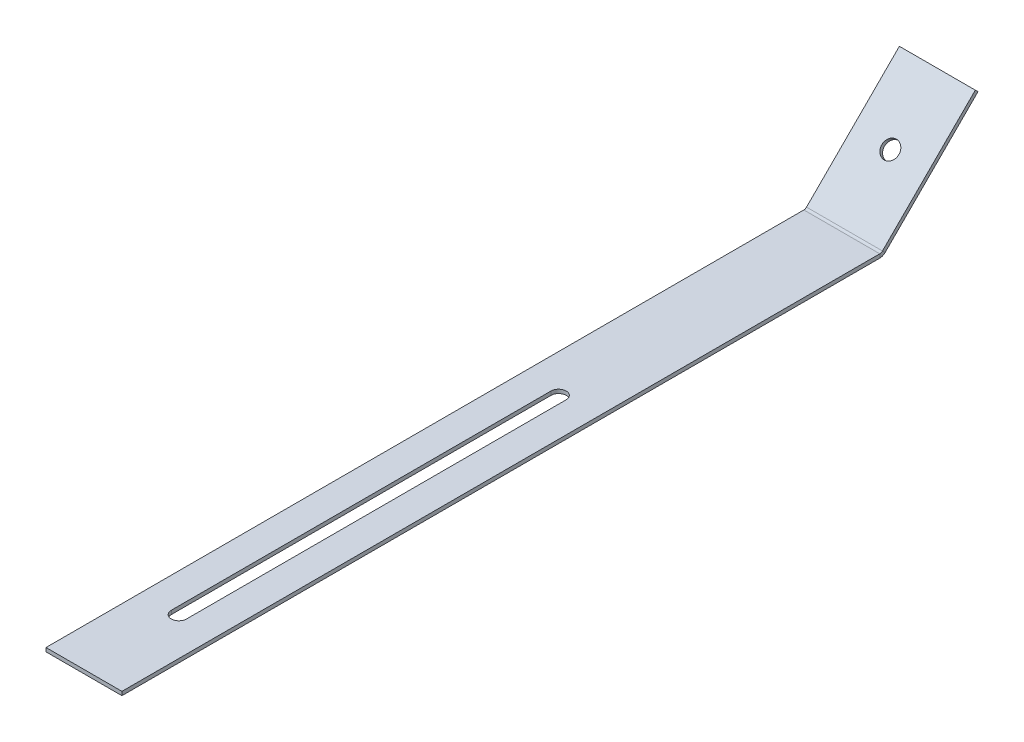
ISO-10303-21;
HEADER;
FILE_DESCRIPTION(('STEP AP214'),'2;1');
FILE_NAME('part.step','',(''),(''),'','','');
FILE_SCHEMA(('AUTOMOTIVE_DESIGN { 1 0 10303 214 1 1 1 1 }'));
ENDSEC;
DATA;
#1=APPLICATION_CONTEXT('core data for automotive mechanical design processes');
#2=APPLICATION_PROTOCOL_DEFINITION('international standard','automotive_design',2000,#1);
#3=PRODUCT_CONTEXT('',#1,'mechanical');
#4=PRODUCT('Part','Part','',(#3));
#5=PRODUCT_RELATED_PRODUCT_CATEGORY('part','',(#4));
#6=PRODUCT_DEFINITION_FORMATION('','',#4);
#7=PRODUCT_DEFINITION_CONTEXT('part definition',#1,'design');
#8=PRODUCT_DEFINITION('design','',#6,#7);
#9=PRODUCT_DEFINITION_SHAPE('','',#8);
#10=(LENGTH_UNIT() NAMED_UNIT(*) SI_UNIT(.MILLI.,.METRE.));
#11=(NAMED_UNIT(*) PLANE_ANGLE_UNIT() SI_UNIT($,.RADIAN.));
#12=(NAMED_UNIT(*) SI_UNIT($,.STERADIAN.) SOLID_ANGLE_UNIT());
#13=UNCERTAINTY_MEASURE_WITH_UNIT(LENGTH_MEASURE(1.E-05),#10,'distance_accuracy_value','');
#14=(GEOMETRIC_REPRESENTATION_CONTEXT(3) GLOBAL_UNCERTAINTY_ASSIGNED_CONTEXT((#13)) GLOBAL_UNIT_ASSIGNED_CONTEXT((#10,
#11,#12)) REPRESENTATION_CONTEXT('',''));
#15=CARTESIAN_POINT('',(0.,0.,0.));
#16=DIRECTION('',(0.,0.,1.));
#17=DIRECTION('',(1.,0.,0.));
#18=AXIS2_PLACEMENT_3D('',#15,#16,#17);
#19=CARTESIAN_POINT('',(40.,0.585786437626914,-400.585786437627));
#20=DIRECTION('',(1.,0.,0.));
#21=DIRECTION('',(0.,0.,-1.));
#22=AXIS2_PLACEMENT_3D('',#19,#20,#21);
#23=PLANE('',#22);
#24=DIRECTION('',(0.,-0.707106781186547,-0.707106781186547));
#25=VECTOR('',#24,1.);
#26=CARTESIAN_POINT('',(40.,0.585786437626914,-400.585786437627));
#27=LINE('',#26,#25);
#28=CARTESIAN_POINT('',(40.,0.585786437626914,-400.585786437627));
#29=VERTEX_POINT('',#28);
#30=CARTESIAN_POINT('',(40.,-0.828427124746176,-402.));
#31=VERTEX_POINT('',#30);
#32=EDGE_CURVE('E11',#29,#31,#27,.T.);
#33=ORIENTED_EDGE('',*,*,#32,.F.);
#34=CARTESIAN_POINT('',(40.,1.99999999999999,-399.171572875254));
#35=DIRECTION('',(-1.,0.,0.));
#36=DIRECTION('',(0.,0.,1.));
#37=AXIS2_PLACEMENT_3D('',#34,#35,#36);
#38=CIRCLE('',#37,2.);
#39=CARTESIAN_POINT('',(40.,0.,-399.171572875254));
#40=VERTEX_POINT('',#39);
#41=EDGE_CURVE('E179',#40,#29,#38,.F.);
#42=ORIENTED_EDGE('',*,*,#41,.F.);
#43=DIRECTION('',(0.,1.,0.));
#44=VECTOR('',#43,1.);
#45=CARTESIAN_POINT('',(40.,-2.00000000000001,-399.171572875254));
#46=LINE('',#45,#44);
#47=CARTESIAN_POINT('',(40.,-2.00000000000001,-399.171572875254));
#48=VERTEX_POINT('',#47);
#49=EDGE_CURVE('E52',#48,#40,#46,.T.);
#50=ORIENTED_EDGE('',*,*,#49,.F.);
#51=CARTESIAN_POINT('',(40.,1.99999999999999,-399.171572875254));
#52=DIRECTION('',(1.,0.,0.));
#53=DIRECTION('',(0.,0.,-1.));
#54=AXIS2_PLACEMENT_3D('',#51,#52,#53);
#55=CIRCLE('',#54,4.);
#56=EDGE_CURVE('E191',#48,#31,#55,.T.);
#57=ORIENTED_EDGE('',*,*,#56,.T.);
#58=EDGE_LOOP('',(#33,#42,#50,#57));
#59=FACE_BOUND('',#58,.T.);
#60=ADVANCED_FACE('F45',(#59),#23,.T.);
#61=CARTESIAN_POINT('',(40.,-2.00000000000001,-399.171572875254));
#62=DIRECTION('',(1.,0.,0.));
#63=DIRECTION('',(0.,0.,-1.));
#64=AXIS2_PLACEMENT_3D('',#61,#62,#63);
#65=PLANE('',#64);
#66=DIRECTION('',(0.,0.70710678118655,-0.707106781186545));
#67=VECTOR('',#66,1.);
#68=CARTESIAN_POINT('',(40.,0.,-400.));
#69=LINE('',#68,#67);
#70=CARTESIAN_POINT('',(40.,49.4974746830584,-449.497474683058));
#71=VERTEX_POINT('',#70);
#72=EDGE_CURVE('E176',#29,#71,#69,.T.);
#73=ORIENTED_EDGE('',*,*,#72,.F.);
#74=ORIENTED_EDGE('',*,*,#32,.T.);
#75=DIRECTION('',(0.,0.70710678118655,-0.707106781186545));
#76=VECTOR('',#75,1.);
#77=CARTESIAN_POINT('',(40.,-1.41421356237309,-401.414213562373));
#78=LINE('',#77,#76);
#79=CARTESIAN_POINT('',(40.,48.0832611206854,-450.911688245431));
#80=VERTEX_POINT('',#79);
#81=EDGE_CURVE('E170',#31,#80,#78,.T.);
#82=ORIENTED_EDGE('',*,*,#81,.T.);
#83=DIRECTION('',(0.,-0.707106781186547,-0.707106781186547));
#84=VECTOR('',#83,1.);
#85=CARTESIAN_POINT('',(40.,49.4974746830584,-449.497474683058));
#86=LINE('',#85,#84);
#87=EDGE_CURVE('E172',#71,#80,#86,.T.);
#88=ORIENTED_EDGE('',*,*,#87,.F.);
#89=EDGE_LOOP('',(#73,#74,#82,#88));
#90=FACE_BOUND('',#89,.T.);
#91=ADVANCED_FACE('F272',(#90),#65,.T.);
#92=CARTESIAN_POINT('',(0.,0.,-399.171572875254));
#93=DIRECTION('',(-1.,0.,0.));
#94=DIRECTION('',(0.,0.,1.));
#95=AXIS2_PLACEMENT_3D('',#92,#93,#94);
#96=PLANE('',#95);
#97=DIRECTION('',(0.,-1.,0.));
#98=VECTOR('',#97,1.);
#99=CARTESIAN_POINT('',(0.,0.,-399.171572875254));
#100=LINE('',#99,#98);
#101=CARTESIAN_POINT('',(0.,0.,-399.171572875254));
#102=VERTEX_POINT('',#101);
#103=CARTESIAN_POINT('',(0.,-2.00000000000001,-399.171572875254));
#104=VERTEX_POINT('',#103);
#105=EDGE_CURVE('E238',#102,#104,#100,.T.);
#106=ORIENTED_EDGE('',*,*,#105,.F.);
#107=CARTESIAN_POINT('',(0.,1.99999999999999,-399.171572875254));
#108=DIRECTION('',(-1.,0.,0.));
#109=DIRECTION('',(0.,0.,1.));
#110=AXIS2_PLACEMENT_3D('',#107,#108,#109);
#111=CIRCLE('',#110,2.);
#112=CARTESIAN_POINT('',(0.,0.585786437626914,-400.585786437627));
#113=VERTEX_POINT('',#112);
#114=EDGE_CURVE('E203',#102,#113,#111,.F.);
#115=ORIENTED_EDGE('',*,*,#114,.T.);
#116=DIRECTION('',(0.,0.707106781186547,0.707106781186547));
#117=VECTOR('',#116,1.);
#118=CARTESIAN_POINT('',(0.,-0.828427124746176,-402.));
#119=LINE('',#118,#117);
#120=CARTESIAN_POINT('',(0.,-0.828427124746176,-402.));
#121=VERTEX_POINT('',#120);
#122=EDGE_CURVE('E236',#121,#113,#119,.T.);
#123=ORIENTED_EDGE('',*,*,#122,.F.);
#124=CARTESIAN_POINT('',(0.,1.99999999999999,-399.171572875254));
#125=DIRECTION('',(1.,0.,0.));
#126=DIRECTION('',(0.,0.,-1.));
#127=AXIS2_PLACEMENT_3D('',#124,#125,#126);
#128=CIRCLE('',#127,4.);
#129=EDGE_CURVE('E173',#104,#121,#128,.T.);
#130=ORIENTED_EDGE('',*,*,#129,.F.);
#131=EDGE_LOOP('',(#106,#115,#123,#130));
#132=FACE_BOUND('',#131,.T.);
#133=ADVANCED_FACE('F279',(#132),#96,.T.);
#134=CARTESIAN_POINT('',(0.,-0.828427124746176,-402.));
#135=DIRECTION('',(-1.,0.,0.));
#136=DIRECTION('',(0.,0.,1.));
#137=AXIS2_PLACEMENT_3D('',#134,#135,#136);
#138=PLANE('',#137);
#139=DIRECTION('',(0.,0.,-1.));
#140=VECTOR('',#139,1.);
#141=CARTESIAN_POINT('',(0.,0.,0.));
#142=LINE('',#141,#140);
#143=CARTESIAN_POINT('',(0.,0.,0.));
#144=VERTEX_POINT('',#143);
#145=EDGE_CURVE('E206',#144,#102,#142,.T.);
#146=ORIENTED_EDGE('',*,*,#145,.T.);
#147=ORIENTED_EDGE('',*,*,#105,.T.);
#148=DIRECTION('',(0.,0.,-1.));
#149=VECTOR('',#148,1.);
#150=CARTESIAN_POINT('',(0.,-2.,0.));
#151=LINE('',#150,#149);
#152=CARTESIAN_POINT('',(0.,-2.,0.));
#153=VERTEX_POINT('',#152);
#154=EDGE_CURVE('E212',#153,#104,#151,.T.);
#155=ORIENTED_EDGE('',*,*,#154,.F.);
#156=DIRECTION('',(0.,1.,0.));
#157=VECTOR('',#156,1.);
#158=CARTESIAN_POINT('',(0.,-2.,0.));
#159=LINE('',#158,#157);
#160=EDGE_CURVE('E209',#153,#144,#159,.T.);
#161=ORIENTED_EDGE('',*,*,#160,.T.);
#162=EDGE_LOOP('',(#146,#147,#155,#161));
#163=FACE_BOUND('',#162,.T.);
#164=ADVANCED_FACE('F281',(#163),#138,.T.);
#165=CARTESIAN_POINT('',(40.,-1.41421356237309,-401.414213562373));
#166=DIRECTION('',(0.,0.707106781186545,0.70710678118655));
#167=DIRECTION('',(0.,-0.70710678118655,0.707106781186545));
#168=AXIS2_PLACEMENT_3D('',#165,#166,#167);
#169=PLANE('',#168);
#170=CARTESIAN_POINT('',(20.,23.3345237791561,-426.162950903902));
#171=DIRECTION('',(0.,0.707106781186545,0.70710678118655));
#172=DIRECTION('',(0.,-0.70710678118655,0.707106781186545));
#173=AXIS2_PLACEMENT_3D('',#170,#171,#172);
#174=CIRCLE('',#173,4.50000000000001);
#175=CARTESIAN_POINT('',(20.,20.1525432638167,-422.980970388563));
#176=VERTEX_POINT('',#175);
#177=EDGE_CURVE('E166',#176,#176,#174,.F.);
#178=ORIENTED_EDGE('',*,*,#177,.F.);
#179=EDGE_LOOP('',(#178));
#180=FACE_BOUND('',#179,.T.);
#181=DIRECTION('',(0.,0.70710678118655,-0.707106781186545));
#182=VECTOR('',#181,1.);
#183=CARTESIAN_POINT('',(0.,-1.41421356237309,-401.414213562373));
#184=LINE('',#183,#182);
#185=CARTESIAN_POINT('',(0.,48.0832611206854,-450.911688245431));
#186=VERTEX_POINT('',#185);
#187=EDGE_CURVE('E169',#121,#186,#184,.T.);
#188=ORIENTED_EDGE('',*,*,#187,.T.);
#189=DIRECTION('',(-1.,0.,0.));
#190=VECTOR('',#189,1.);
#191=CARTESIAN_POINT('',(40.,48.0832611206854,-450.911688245431));
#192=LINE('',#191,#190);
#193=EDGE_CURVE('E234',#80,#186,#192,.T.);
#194=ORIENTED_EDGE('',*,*,#193,.F.);
#195=ORIENTED_EDGE('',*,*,#81,.F.);
#196=DIRECTION('',(-1.,0.,0.));
#197=VECTOR('',#196,1.);
#198=CARTESIAN_POINT('',(40.,-0.828427124746176,-402.));
#199=LINE('',#198,#197);
#200=EDGE_CURVE('E194',#31,#121,#199,.T.);
#201=ORIENTED_EDGE('',*,*,#200,.T.);
#202=EDGE_LOOP('',(#188,#194,#195,#201));
#203=FACE_BOUND('',#202,.T.);
#204=ADVANCED_FACE('F268',(#180,#203),#169,.F.);
#205=CARTESIAN_POINT('',(40.,49.4974746830584,-449.497474683058));
#206=DIRECTION('',(0.,0.707106781186548,-0.707106781186548));
#207=DIRECTION('',(0.,0.707106781186548,0.707106781186548));
#208=AXIS2_PLACEMENT_3D('',#205,#206,#207);
#209=PLANE('',#208);
#210=DIRECTION('',(0.,-0.707106781186547,-0.707106781186547));
#211=VECTOR('',#210,1.);
#212=CARTESIAN_POINT('',(0.,49.4974746830584,-449.497474683058));
#213=LINE('',#212,#211);
#214=CARTESIAN_POINT('',(0.,49.4974746830584,-449.497474683058));
#215=VERTEX_POINT('',#214);
#216=EDGE_CURVE('E197',#215,#186,#213,.T.);
#217=ORIENTED_EDGE('',*,*,#216,.F.);
#218=DIRECTION('',(-1.,0.,0.));
#219=VECTOR('',#218,1.);
#220=CARTESIAN_POINT('',(40.,49.4974746830584,-449.497474683058));
#221=LINE('',#220,#219);
#222=EDGE_CURVE('E232',#71,#215,#221,.T.);
#223=ORIENTED_EDGE('',*,*,#222,.F.);
#224=ORIENTED_EDGE('',*,*,#87,.T.);
#225=ORIENTED_EDGE('',*,*,#193,.T.);
#226=EDGE_LOOP('',(#217,#223,#224,#225));
#227=FACE_BOUND('',#226,.T.);
#228=ADVANCED_FACE('F289',(#227),#209,.T.);
#229=CARTESIAN_POINT('',(40.,0.,-400.));
#230=DIRECTION('',(0.,0.707106781186545,0.70710678118655));
#231=DIRECTION('',(0.,-0.70710678118655,0.707106781186545));
#232=AXIS2_PLACEMENT_3D('',#229,#230,#231);
#233=PLANE('',#232);
#234=CARTESIAN_POINT('',(20.,24.7487373415292,-424.748737341529));
#235=DIRECTION('',(0.,0.707106781186546,0.70710678118655));
#236=DIRECTION('',(0.,-0.70710678118655,0.707106781186546));
#237=AXIS2_PLACEMENT_3D('',#234,#235,#236);
#238=CIRCLE('',#237,4.50000000000001);
#239=CARTESIAN_POINT('',(20.,21.5667568261897,-421.56675682619));
#240=VERTEX_POINT('',#239);
#241=EDGE_CURVE('E162',#240,#240,#238,.T.);
#242=ORIENTED_EDGE('',*,*,#241,.F.);
#243=EDGE_LOOP('',(#242));
#244=FACE_BOUND('',#243,.T.);
#245=DIRECTION('',(0.,0.70710678118655,-0.707106781186545));
#246=VECTOR('',#245,1.);
#247=CARTESIAN_POINT('',(0.,0.,-400.));
#248=LINE('',#247,#246);
#249=EDGE_CURVE('E200',#113,#215,#248,.T.);
#250=ORIENTED_EDGE('',*,*,#249,.F.);
#251=DIRECTION('',(-1.,0.,0.));
#252=VECTOR('',#251,1.);
#253=CARTESIAN_POINT('',(40.,0.585786437626914,-400.585786437627));
#254=LINE('',#253,#252);
#255=EDGE_CURVE('E229',#29,#113,#254,.T.);
#256=ORIENTED_EDGE('',*,*,#255,.F.);
#257=ORIENTED_EDGE('',*,*,#72,.T.);
#258=ORIENTED_EDGE('',*,*,#222,.T.);
#259=EDGE_LOOP('',(#250,#256,#257,#258));
#260=FACE_BOUND('',#259,.T.);
#261=ADVANCED_FACE('F275',(#244,#260),#233,.T.);
#262=CARTESIAN_POINT('',(40.,1.99999999999999,-399.171572875254));
#263=DIRECTION('',(-1.,0.,0.));
#264=DIRECTION('',(0.,0.,1.));
#265=AXIS2_PLACEMENT_3D('',#262,#263,#264);
#266=CYLINDRICAL_SURFACE('',#265,2.);
#267=ORIENTED_EDGE('',*,*,#114,.F.);
#268=DIRECTION('',(-1.,0.,0.));
#269=VECTOR('',#268,1.);
#270=CARTESIAN_POINT('',(40.,0.,-399.171572875254));
#271=LINE('',#270,#269);
#272=EDGE_CURVE('E226',#40,#102,#271,.T.);
#273=ORIENTED_EDGE('',*,*,#272,.F.);
#274=ORIENTED_EDGE('',*,*,#41,.T.);
#275=ORIENTED_EDGE('',*,*,#255,.T.);
#276=EDGE_LOOP('',(#267,#273,#274,#275));
#277=FACE_BOUND('',#276,.T.);
#278=ADVANCED_FACE('F250',(#277),#266,.F.);
#279=CARTESIAN_POINT('',(40.,0.,0.));
#280=DIRECTION('',(0.,1.,0.));
#281=DIRECTION('',(0.,0.,1.));
#282=AXIS2_PLACEMENT_3D('',#279,#280,#281);
#283=PLANE('',#282);
#284=CARTESIAN_POINT('',(20.,0.,-250.));
#285=DIRECTION('',(0.,1.,0.));
#286=DIRECTION('',(0.,0.,1.));
#287=AXIS2_PLACEMENT_3D('',#284,#285,#286);
#288=CIRCLE('',#287,4.);
#289=CARTESIAN_POINT('',(24.,0.,-250.));
#290=VERTEX_POINT('',#289);
#291=CARTESIAN_POINT('',(16.,0.,-250.));
#292=VERTEX_POINT('',#291);
#293=EDGE_CURVE('E59',#290,#292,#288,.T.);
#294=ORIENTED_EDGE('',*,*,#293,.F.);
#295=DIRECTION('',(0.,0.,-1.));
#296=VECTOR('',#295,1.);
#297=CARTESIAN_POINT('',(24.,0.,-49.9999999999999));
#298=LINE('',#297,#296);
#299=CARTESIAN_POINT('',(24.,0.,-49.9999999999999));
#300=VERTEX_POINT('',#299);
#301=EDGE_CURVE('E151',#300,#290,#298,.T.);
#302=ORIENTED_EDGE('',*,*,#301,.F.);
#303=CARTESIAN_POINT('',(20.,0.,-49.9999999999999));
#304=DIRECTION('',(0.,1.,0.));
#305=DIRECTION('',(0.,0.,1.));
#306=AXIS2_PLACEMENT_3D('',#303,#304,#305);
#307=CIRCLE('',#306,4.);
#308=CARTESIAN_POINT('',(16.,0.,-49.9999999999999));
#309=VERTEX_POINT('',#308);
#310=EDGE_CURVE('E135',#309,#300,#307,.T.);
#311=ORIENTED_EDGE('',*,*,#310,.F.);
#312=DIRECTION('',(0.,0.,1.));
#313=VECTOR('',#312,1.);
#314=CARTESIAN_POINT('',(16.,0.,-49.9999999999999));
#315=LINE('',#314,#313);
#316=EDGE_CURVE('E144',#292,#309,#315,.T.);
#317=ORIENTED_EDGE('',*,*,#316,.F.);
#318=EDGE_LOOP('',(#294,#302,#311,#317));
#319=FACE_BOUND('',#318,.T.);
#320=ORIENTED_EDGE('',*,*,#145,.F.);
#321=DIRECTION('',(-1.,0.,0.));
#322=VECTOR('',#321,1.);
#323=CARTESIAN_POINT('',(40.,0.,0.));
#324=LINE('',#323,#322);
#325=CARTESIAN_POINT('',(40.,0.,0.));
#326=VERTEX_POINT('',#325);
#327=EDGE_CURVE('E224',#326,#144,#324,.T.);
#328=ORIENTED_EDGE('',*,*,#327,.F.);
#329=DIRECTION('',(0.,0.,-1.));
#330=VECTOR('',#329,1.);
#331=CARTESIAN_POINT('',(40.,0.,0.));
#332=LINE('',#331,#330);
#333=EDGE_CURVE('E182',#326,#40,#332,.T.);
#334=ORIENTED_EDGE('',*,*,#333,.T.);
#335=ORIENTED_EDGE('',*,*,#272,.T.);
#336=EDGE_LOOP('',(#320,#328,#334,#335));
#337=FACE_BOUND('',#336,.T.);
#338=ADVANCED_FACE('F148',(#319,#337),#283,.T.);
#339=CARTESIAN_POINT('',(40.,-2.,0.));
#340=DIRECTION('',(0.,0.,1.));
#341=DIRECTION('',(1.,0.,0.));
#342=AXIS2_PLACEMENT_3D('',#339,#340,#341);
#343=PLANE('',#342);
#344=ORIENTED_EDGE('',*,*,#160,.F.);
#345=DIRECTION('',(-1.,0.,0.));
#346=VECTOR('',#345,1.);
#347=CARTESIAN_POINT('',(40.,-2.,0.));
#348=LINE('',#347,#346);
#349=CARTESIAN_POINT('',(40.,-2.,0.));
#350=VERTEX_POINT('',#349);
#351=EDGE_CURVE('E222',#350,#153,#348,.T.);
#352=ORIENTED_EDGE('',*,*,#351,.F.);
#353=DIRECTION('',(0.,1.,0.));
#354=VECTOR('',#353,1.);
#355=CARTESIAN_POINT('',(40.,-2.,0.));
#356=LINE('',#355,#354);
#357=EDGE_CURVE('E185',#350,#326,#356,.T.);
#358=ORIENTED_EDGE('',*,*,#357,.T.);
#359=ORIENTED_EDGE('',*,*,#327,.T.);
#360=EDGE_LOOP('',(#344,#352,#358,#359));
#361=FACE_BOUND('',#360,.T.);
#362=ADVANCED_FACE('F255',(#361),#343,.T.);
#363=CARTESIAN_POINT('',(40.,-2.,0.));
#364=DIRECTION('',(0.,1.,0.));
#365=DIRECTION('',(0.,0.,1.));
#366=AXIS2_PLACEMENT_3D('',#363,#364,#365);
#367=PLANE('',#366);
#368=DIRECTION('',(0.,0.,1.));
#369=VECTOR('',#368,1.);
#370=CARTESIAN_POINT('',(24.,-2.,-49.9999999999999));
#371=LINE('',#370,#369);
#372=CARTESIAN_POINT('',(24.,-2.,-250.));
#373=VERTEX_POINT('',#372);
#374=CARTESIAN_POINT('',(24.,-2.,-49.9999999999999));
#375=VERTEX_POINT('',#374);
#376=EDGE_CURVE('E483',#373,#375,#371,.T.);
#377=ORIENTED_EDGE('',*,*,#376,.F.);
#378=CARTESIAN_POINT('',(20.,-2.,-250.));
#379=DIRECTION('',(0.,1.,0.));
#380=DIRECTION('',(0.,0.,1.));
#381=AXIS2_PLACEMENT_3D('',#378,#379,#380);
#382=CIRCLE('',#381,4.);
#383=CARTESIAN_POINT('',(16.,-2.,-250.));
#384=VERTEX_POINT('',#383);
#385=EDGE_CURVE('E163',#384,#373,#382,.F.);
#386=ORIENTED_EDGE('',*,*,#385,.F.);
#387=DIRECTION('',(0.,0.,-1.));
#388=VECTOR('',#387,1.);
#389=CARTESIAN_POINT('',(16.,-2.,-49.9999999999999));
#390=LINE('',#389,#388);
#391=CARTESIAN_POINT('',(16.,-2.,-49.9999999999999));
#392=VERTEX_POINT('',#391);
#393=EDGE_CURVE('E160',#392,#384,#390,.T.);
#394=ORIENTED_EDGE('',*,*,#393,.F.);
#395=CARTESIAN_POINT('',(20.,-2.,-49.9999999999999));
#396=DIRECTION('',(0.,1.,0.));
#397=DIRECTION('',(0.,0.,1.));
#398=AXIS2_PLACEMENT_3D('',#395,#396,#397);
#399=CIRCLE('',#398,4.);
#400=EDGE_CURVE('E138',#375,#392,#399,.F.);
#401=ORIENTED_EDGE('',*,*,#400,.F.);
#402=EDGE_LOOP('',(#377,#386,#394,#401));
#403=FACE_BOUND('',#402,.T.);
#404=ORIENTED_EDGE('',*,*,#154,.T.);
#405=DIRECTION('',(-1.,0.,0.));
#406=VECTOR('',#405,1.);
#407=CARTESIAN_POINT('',(40.,-2.00000000000001,-399.171572875254));
#408=LINE('',#407,#406);
#409=EDGE_CURVE('E219',#48,#104,#408,.T.);
#410=ORIENTED_EDGE('',*,*,#409,.F.);
#411=DIRECTION('',(0.,0.,-1.));
#412=VECTOR('',#411,1.);
#413=CARTESIAN_POINT('',(40.,-2.,0.));
#414=LINE('',#413,#412);
#415=EDGE_CURVE('E188',#350,#48,#414,.T.);
#416=ORIENTED_EDGE('',*,*,#415,.F.);
#417=ORIENTED_EDGE('',*,*,#351,.T.);
#418=EDGE_LOOP('',(#404,#410,#416,#417));
#419=FACE_BOUND('',#418,.T.);
#420=ADVANCED_FACE('F258',(#403,#419),#367,.F.);
#421=CARTESIAN_POINT('',(40.,1.99999999999999,-399.171572875254));
#422=DIRECTION('',(-1.,0.,0.));
#423=DIRECTION('',(0.,0.,1.));
#424=AXIS2_PLACEMENT_3D('',#421,#422,#423);
#425=CYLINDRICAL_SURFACE('',#424,4.);
#426=ORIENTED_EDGE('',*,*,#129,.T.);
#427=ORIENTED_EDGE('',*,*,#200,.F.);
#428=ORIENTED_EDGE('',*,*,#56,.F.);
#429=ORIENTED_EDGE('',*,*,#409,.T.);
#430=EDGE_LOOP('',(#426,#427,#428,#429));
#431=FACE_BOUND('',#430,.T.);
#432=ADVANCED_FACE('F263',(#431),#425,.T.);
#433=CARTESIAN_POINT('',(40.,1.99999999999999,-399.171572875254));
#434=DIRECTION('',(-1.,0.,0.));
#435=DIRECTION('',(0.,0.,1.));
#436=AXIS2_PLACEMENT_3D('',#433,#434,#435);
#437=PLANE('',#436);
#438=ORIENTED_EDGE('',*,*,#415,.T.);
#439=ORIENTED_EDGE('',*,*,#49,.T.);
#440=ORIENTED_EDGE('',*,*,#333,.F.);
#441=ORIENTED_EDGE('',*,*,#357,.F.);
#442=EDGE_LOOP('',(#438,#439,#440,#441));
#443=FACE_BOUND('',#442,.T.);
#444=ADVANCED_FACE('F242',(#443),#437,.F.);
#445=CARTESIAN_POINT('',(0.,1.99999999999999,-399.171572875254));
#446=DIRECTION('',(-1.,0.,0.));
#447=DIRECTION('',(0.,0.,1.));
#448=AXIS2_PLACEMENT_3D('',#445,#446,#447);
#449=PLANE('',#448);
#450=ORIENTED_EDGE('',*,*,#187,.F.);
#451=ORIENTED_EDGE('',*,*,#122,.T.);
#452=ORIENTED_EDGE('',*,*,#249,.T.);
#453=ORIENTED_EDGE('',*,*,#216,.T.);
#454=EDGE_LOOP('',(#450,#451,#452,#453));
#455=FACE_BOUND('',#454,.T.);
#456=ADVANCED_FACE('F395',(#455),#449,.T.);
#457=CARTESIAN_POINT('',(20.,14.3345237791561,-435.162950903902));
#458=DIRECTION('',(0.,0.707106781186545,0.707106781186549));
#459=DIRECTION('',(0.,-0.70710678118655,0.707106781186546));
#460=AXIS2_PLACEMENT_3D('',#457,#458,#459);
#461=CYLINDRICAL_SURFACE('',#460,4.50000000000001);
#462=ORIENTED_EDGE('',*,*,#177,.T.);
#463=EDGE_LOOP('',(#462));
#464=FACE_BOUND('',#463,.T.);
#465=ORIENTED_EDGE('',*,*,#241,.T.);
#466=EDGE_LOOP('',(#465));
#467=FACE_BOUND('',#466,.T.);
#468=ADVANCED_FACE('F404',(#464,#467),#461,.F.);
#469=CARTESIAN_POINT('',(20.,-210.153789300123,-250.));
#470=DIRECTION('',(0.,1.,0.));
#471=DIRECTION('',(0.,0.,1.));
#472=AXIS2_PLACEMENT_3D('',#469,#470,#471);
#473=CYLINDRICAL_SURFACE('',#472,4.);
#474=ORIENTED_EDGE('',*,*,#385,.T.);
#475=DIRECTION('',(0.,1.,0.));
#476=VECTOR('',#475,1.);
#477=CARTESIAN_POINT('',(24.,-210.153789300123,-250.));
#478=LINE('',#477,#476);
#479=EDGE_CURVE('E156',#373,#290,#478,.T.);
#480=ORIENTED_EDGE('',*,*,#479,.T.);
#481=ORIENTED_EDGE('',*,*,#293,.T.);
#482=DIRECTION('',(0.,1.,0.));
#483=VECTOR('',#482,1.);
#484=CARTESIAN_POINT('',(16.,-210.153789300123,-250.));
#485=LINE('',#484,#483);
#486=EDGE_CURVE('E141',#384,#292,#485,.T.);
#487=ORIENTED_EDGE('',*,*,#486,.F.);
#488=EDGE_LOOP('',(#474,#480,#481,#487));
#489=FACE_BOUND('',#488,.T.);
#490=ADVANCED_FACE('F413',(#489),#473,.F.);
#491=CARTESIAN_POINT('',(24.,-210.153789300123,-49.9999999999999));
#492=DIRECTION('',(1.,0.,0.));
#493=DIRECTION('',(0.,0.,-1.));
#494=AXIS2_PLACEMENT_3D('',#491,#492,#493);
#495=PLANE('',#494);
#496=ORIENTED_EDGE('',*,*,#376,.T.);
#497=DIRECTION('',(0.,1.,0.));
#498=VECTOR('',#497,1.);
#499=CARTESIAN_POINT('',(24.,-210.153789300123,-49.9999999999999));
#500=LINE('',#499,#498);
#501=EDGE_CURVE('E140',#375,#300,#500,.T.);
#502=ORIENTED_EDGE('',*,*,#501,.T.);
#503=ORIENTED_EDGE('',*,*,#301,.T.);
#504=ORIENTED_EDGE('',*,*,#479,.F.);
#505=EDGE_LOOP('',(#496,#502,#503,#504));
#506=FACE_BOUND('',#505,.T.);
#507=ADVANCED_FACE('F423',(#506),#495,.F.);
#508=CARTESIAN_POINT('',(20.,-210.153789300123,-49.9999999999999));
#509=DIRECTION('',(0.,1.,0.));
#510=DIRECTION('',(0.,0.,1.));
#511=AXIS2_PLACEMENT_3D('',#508,#509,#510);
#512=CYLINDRICAL_SURFACE('',#511,4.);
#513=ORIENTED_EDGE('',*,*,#400,.T.);
#514=DIRECTION('',(0.,1.,0.));
#515=VECTOR('',#514,1.);
#516=CARTESIAN_POINT('',(16.,-210.153789300123,-49.9999999999999));
#517=LINE('',#516,#515);
#518=EDGE_CURVE('E67',#392,#309,#517,.T.);
#519=ORIENTED_EDGE('',*,*,#518,.T.);
#520=ORIENTED_EDGE('',*,*,#310,.T.);
#521=ORIENTED_EDGE('',*,*,#501,.F.);
#522=EDGE_LOOP('',(#513,#519,#520,#521));
#523=FACE_BOUND('',#522,.T.);
#524=ADVANCED_FACE('F132',(#523),#512,.F.);
#525=CARTESIAN_POINT('',(16.,-210.153789300123,-49.9999999999999));
#526=DIRECTION('',(-1.,0.,0.));
#527=DIRECTION('',(0.,0.,1.));
#528=AXIS2_PLACEMENT_3D('',#525,#526,#527);
#529=PLANE('',#528);
#530=ORIENTED_EDGE('',*,*,#393,.T.);
#531=ORIENTED_EDGE('',*,*,#486,.T.);
#532=ORIENTED_EDGE('',*,*,#316,.T.);
#533=ORIENTED_EDGE('',*,*,#518,.F.);
#534=EDGE_LOOP('',(#530,#531,#532,#533));
#535=FACE_BOUND('',#534,.T.);
#536=ADVANCED_FACE('F145',(#535),#529,.F.);
#537=CLOSED_SHELL('',(#60,#91,#133,#164,#204,#228,#261,#278,#338,#362,#420,#432,#444,#456,#468,
#490,#507,#524,#536));
#538=MANIFOLD_SOLID_BREP('B2',#537);
#539=ADVANCED_BREP_SHAPE_REPRESENTATION('',(#18,#538),#14);
#540=SHAPE_DEFINITION_REPRESENTATION(#9,#539);
ENDSEC;
END-ISO-10303-21;
